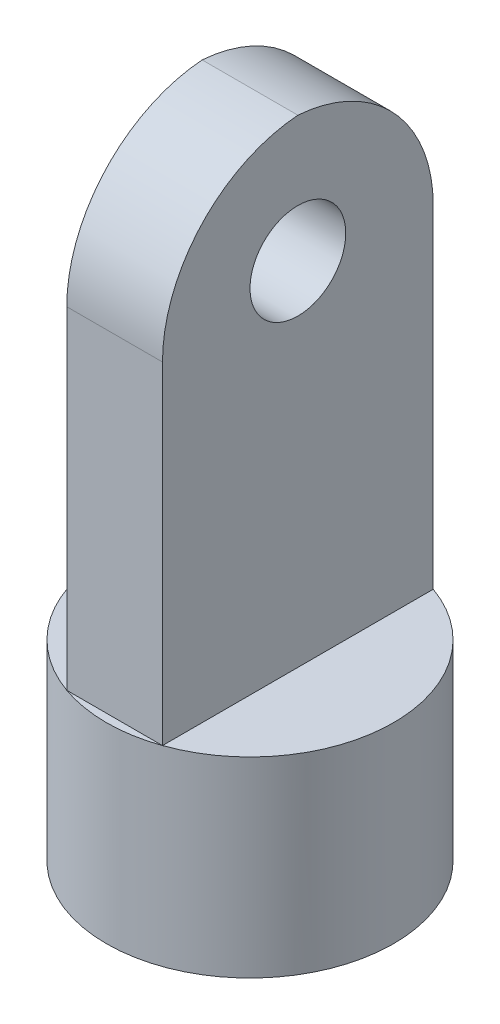
ISO-10303-21;
HEADER;
FILE_DESCRIPTION(('STEP AP214'),'2;1');
FILE_NAME('part.step','',(''),(''),'','','');
FILE_SCHEMA(('AUTOMOTIVE_DESIGN { 1 0 10303 214 1 1 1 1 }'));
ENDSEC;
DATA;
#1=APPLICATION_CONTEXT('core data for automotive mechanical design processes');
#2=APPLICATION_PROTOCOL_DEFINITION('international standard','automotive_design',2000,#1);
#3=PRODUCT_CONTEXT('',#1,'mechanical');
#4=PRODUCT('Part','Part','',(#3));
#5=PRODUCT_RELATED_PRODUCT_CATEGORY('part','',(#4));
#6=PRODUCT_DEFINITION_FORMATION('','',#4);
#7=PRODUCT_DEFINITION_CONTEXT('part definition',#1,'design');
#8=PRODUCT_DEFINITION('design','',#6,#7);
#9=PRODUCT_DEFINITION_SHAPE('','',#8);
#10=(LENGTH_UNIT() NAMED_UNIT(*) SI_UNIT(.MILLI.,.METRE.));
#11=(NAMED_UNIT(*) PLANE_ANGLE_UNIT() SI_UNIT($,.RADIAN.));
#12=(NAMED_UNIT(*) SI_UNIT($,.STERADIAN.) SOLID_ANGLE_UNIT());
#13=UNCERTAINTY_MEASURE_WITH_UNIT(LENGTH_MEASURE(1.E-05),#10,'distance_accuracy_value','');
#14=(GEOMETRIC_REPRESENTATION_CONTEXT(3) GLOBAL_UNCERTAINTY_ASSIGNED_CONTEXT((#13)) GLOBAL_UNIT_ASSIGNED_CONTEXT((#10,
#11,#12)) REPRESENTATION_CONTEXT('',''));
#15=CARTESIAN_POINT('',(0.,0.,0.));
#16=DIRECTION('',(0.,0.,1.));
#17=DIRECTION('',(1.,0.,0.));
#18=AXIS2_PLACEMENT_3D('',#15,#16,#17);
#19=CARTESIAN_POINT('',(0.,10.,0.));
#20=DIRECTION('',(0.,1.,0.));
#21=DIRECTION('',(0.,0.,1.));
#22=AXIS2_PLACEMENT_3D('',#19,#20,#21);
#23=PLANE('',#22);
#24=DIRECTION('',(0.,0.,-1.));
#25=VECTOR('',#24,1.);
#26=CARTESIAN_POINT('',(2.5,10.,7.07106781186547));
#27=LINE('',#26,#25);
#28=CARTESIAN_POINT('',(2.5,10.,7.07106781186547));
#29=VERTEX_POINT('',#28);
#30=CARTESIAN_POINT('',(2.5,10.,-7.07106781186548));
#31=VERTEX_POINT('',#30);
#32=EDGE_CURVE('E116',#29,#31,#27,.T.);
#33=ORIENTED_EDGE('',*,*,#32,.F.);
#34=CARTESIAN_POINT('',(0.,10.,0.));
#35=DIRECTION('',(0.,1.,0.));
#36=DIRECTION('',(0.,0.,1.));
#37=AXIS2_PLACEMENT_3D('',#34,#35,#36);
#38=CIRCLE('',#37,7.5);
#39=EDGE_CURVE('E102',#29,#31,#38,.T.);
#40=ORIENTED_EDGE('',*,*,#39,.T.);
#41=EDGE_LOOP('',(#33,#40));
#42=FACE_BOUND('',#41,.T.);
#43=ADVANCED_FACE('F33',(#42),#23,.T.);
#44=DIRECTION('',(1.,0.,0.));
#45=VECTOR('',#44,1.);
#46=CARTESIAN_POINT('',(-2.5,10.,7.07106781186547));
#47=LINE('',#46,#45);
#48=CARTESIAN_POINT('',(-2.5,10.,7.07106781186547));
#49=VERTEX_POINT('',#48);
#50=EDGE_CURVE('E113',#49,#29,#47,.T.);
#51=ORIENTED_EDGE('',*,*,#50,.F.);
#52=EDGE_CURVE('E110',#49,#29,#38,.T.);
#53=ORIENTED_EDGE('',*,*,#52,.T.);
#54=EDGE_LOOP('',(#51,#53));
#55=FACE_BOUND('',#54,.T.);
#56=ADVANCED_FACE('F150',(#55),#23,.T.);
#57=DIRECTION('',(0.,0.,1.));
#58=VECTOR('',#57,1.);
#59=CARTESIAN_POINT('',(-2.5,10.,7.07106781186547));
#60=LINE('',#59,#58);
#61=CARTESIAN_POINT('',(-2.5,10.,-7.07106781186548));
#62=VERTEX_POINT('',#61);
#63=EDGE_CURVE('E82',#62,#49,#60,.T.);
#64=ORIENTED_EDGE('',*,*,#63,.F.);
#65=EDGE_CURVE('E103',#62,#49,#38,.T.);
#66=ORIENTED_EDGE('',*,*,#65,.T.);
#67=EDGE_LOOP('',(#64,#66));
#68=FACE_BOUND('',#67,.T.);
#69=ADVANCED_FACE('F112',(#68),#23,.T.);
#70=CARTESIAN_POINT('',(0.,10.,0.));
#71=DIRECTION('',(0.,-1.,0.));
#72=DIRECTION('',(0.,0.,-1.));
#73=AXIS2_PLACEMENT_3D('',#70,#71,#72);
#74=CYLINDRICAL_SURFACE('',#73,7.5);
#75=ORIENTED_EDGE('',*,*,#39,.F.);
#76=ORIENTED_EDGE('',*,*,#52,.F.);
#77=ORIENTED_EDGE('',*,*,#65,.F.);
#78=EDGE_CURVE('E95',#31,#62,#38,.T.);
#79=ORIENTED_EDGE('',*,*,#78,.F.);
#80=EDGE_LOOP('',(#75,#76,#77,#79));
#81=FACE_BOUND('',#80,.T.);
#82=CARTESIAN_POINT('',(0.,0.,0.));
#83=DIRECTION('',(0.,1.,0.));
#84=DIRECTION('',(0.,0.,1.));
#85=AXIS2_PLACEMENT_3D('',#82,#83,#84);
#86=CIRCLE('',#85,7.5);
#87=CARTESIAN_POINT('',(0.,0.,7.5));
#88=VERTEX_POINT('',#87);
#89=EDGE_CURVE('E133',#88,#88,#86,.T.);
#90=ORIENTED_EDGE('',*,*,#89,.T.);
#91=EDGE_LOOP('',(#90));
#92=FACE_BOUND('',#91,.T.);
#93=ADVANCED_FACE('F107',(#81,#92),#74,.T.);
#94=DIRECTION('',(-1.,0.,0.));
#95=VECTOR('',#94,1.);
#96=CARTESIAN_POINT('',(-2.5,10.,-7.07106781186548));
#97=LINE('',#96,#95);
#98=EDGE_CURVE('E98',#31,#62,#97,.T.);
#99=ORIENTED_EDGE('',*,*,#98,.F.);
#100=ORIENTED_EDGE('',*,*,#78,.T.);
#101=EDGE_LOOP('',(#99,#100));
#102=FACE_BOUND('',#101,.T.);
#103=ADVANCED_FACE('F97',(#102),#23,.T.);
#104=CARTESIAN_POINT('',(0.,0.,0.));
#105=DIRECTION('',(0.,1.,0.));
#106=DIRECTION('',(0.,0.,1.));
#107=AXIS2_PLACEMENT_3D('',#104,#105,#106);
#108=PLANE('',#107);
#109=CARTESIAN_POINT('',(0.,0.,0.));
#110=DIRECTION('',(0.,-1.,0.));
#111=DIRECTION('',(0.,0.,-1.));
#112=AXIS2_PLACEMENT_3D('',#109,#110,#111);
#113=CIRCLE('',#112,6.25);
#114=CARTESIAN_POINT('',(0.,0.,-6.25));
#115=VERTEX_POINT('',#114);
#116=EDGE_CURVE('E129',#115,#115,#113,.T.);
#117=ORIENTED_EDGE('',*,*,#116,.F.);
#118=EDGE_LOOP('',(#117));
#119=FACE_BOUND('',#118,.T.);
#120=ORIENTED_EDGE('',*,*,#89,.F.);
#121=EDGE_LOOP('',(#120));
#122=FACE_BOUND('',#121,.T.);
#123=ADVANCED_FACE('F174',(#119,#122),#108,.F.);
#124=CARTESIAN_POINT('',(0.,7.5,0.));
#125=DIRECTION('',(0.,-1.,0.));
#126=DIRECTION('',(0.,0.,-1.));
#127=AXIS2_PLACEMENT_3D('',#124,#125,#126);
#128=CYLINDRICAL_SURFACE('',#127,6.25);
#129=CARTESIAN_POINT('',(0.,7.5,0.));
#130=DIRECTION('',(0.,-1.,0.));
#131=DIRECTION('',(0.,0.,-1.));
#132=AXIS2_PLACEMENT_3D('',#129,#130,#131);
#133=CIRCLE('',#132,6.25);
#134=CARTESIAN_POINT('',(0.,7.5,-6.25));
#135=VERTEX_POINT('',#134);
#136=EDGE_CURVE('E130',#135,#135,#133,.T.);
#137=ORIENTED_EDGE('',*,*,#136,.F.);
#138=EDGE_LOOP('',(#137));
#139=FACE_BOUND('',#138,.T.);
#140=ORIENTED_EDGE('',*,*,#116,.T.);
#141=EDGE_LOOP('',(#140));
#142=FACE_BOUND('',#141,.T.);
#143=ADVANCED_FACE('F179',(#139,#142),#128,.F.);
#144=CARTESIAN_POINT('',(0.,7.5,0.));
#145=DIRECTION('',(0.,-1.,0.));
#146=DIRECTION('',(0.,0.,-1.));
#147=AXIS2_PLACEMENT_3D('',#144,#145,#146);
#148=PLANE('',#147);
#149=ORIENTED_EDGE('',*,*,#136,.T.);
#150=EDGE_LOOP('',(#149));
#151=FACE_BOUND('',#150,.T.);
#152=ADVANCED_FACE('F216',(#151),#148,.T.);
#153=CARTESIAN_POINT('',(2.5,35.,7.07106781186547));
#154=DIRECTION('',(-1.,0.,0.));
#155=DIRECTION('',(0.,0.,1.));
#156=AXIS2_PLACEMENT_3D('',#153,#154,#155);
#157=PLANE('',#156);
#158=CARTESIAN_POINT('',(2.5,28.3918354921298,0.));
#159=DIRECTION('',(1.,0.,0.));
#160=DIRECTION('',(0.,0.,-1.));
#161=AXIS2_PLACEMENT_3D('',#158,#159,#160);
#162=CIRCLE('',#161,2.5);
#163=CARTESIAN_POINT('',(2.5,28.3918354921298,-2.5));
#164=VERTEX_POINT('',#163);
#165=EDGE_CURVE('E158',#164,#164,#162,.T.);
#166=ORIENTED_EDGE('',*,*,#165,.F.);
#167=EDGE_LOOP('',(#166));
#168=FACE_BOUND('',#167,.T.);
#169=DIRECTION('',(0.,-1.,0.));
#170=VECTOR('',#169,1.);
#171=CARTESIAN_POINT('',(2.5,35.,-7.07106781186548));
#172=LINE('',#171,#170);
#173=CARTESIAN_POINT('',(2.5,27.35,-7.07106781186548));
#174=VERTEX_POINT('',#173);
#175=EDGE_CURVE('E89',#174,#31,#172,.T.);
#176=ORIENTED_EDGE('',*,*,#175,.F.);
#177=CARTESIAN_POINT('',(2.5,27.35,0.578932188134525));
#178=DIRECTION('',(-1.,0.,0.));
#179=DIRECTION('',(0.,0.,1.));
#180=AXIS2_PLACEMENT_3D('',#177,#178,#179);
#181=CIRCLE('',#180,7.65);
#182=CARTESIAN_POINT('',(2.5,34.978062501156,0.));
#183=VERTEX_POINT('',#182);
#184=EDGE_CURVE('E42',#174,#183,#181,.F.);
#185=ORIENTED_EDGE('',*,*,#184,.T.);
#186=CARTESIAN_POINT('',(2.5,27.35,-0.578932188134526));
#187=DIRECTION('',(-1.,0.,0.));
#188=DIRECTION('',(0.,0.,1.));
#189=AXIS2_PLACEMENT_3D('',#186,#187,#188);
#190=CIRCLE('',#189,7.65);
#191=CARTESIAN_POINT('',(2.5,27.35,7.07106781186547));
#192=VERTEX_POINT('',#191);
#193=EDGE_CURVE('E52',#183,#192,#190,.F.);
#194=ORIENTED_EDGE('',*,*,#193,.T.);
#195=DIRECTION('',(0.,-1.,0.));
#196=VECTOR('',#195,1.);
#197=CARTESIAN_POINT('',(2.5,35.,7.07106781186547));
#198=LINE('',#197,#196);
#199=EDGE_CURVE('E125',#192,#29,#198,.T.);
#200=ORIENTED_EDGE('',*,*,#199,.T.);
#201=ORIENTED_EDGE('',*,*,#32,.T.);
#202=EDGE_LOOP('',(#176,#185,#194,#200,#201));
#203=FACE_BOUND('',#202,.T.);
#204=ADVANCED_FACE('F145',(#168,#203),#157,.F.);
#205=CARTESIAN_POINT('',(-2.5,35.,-7.07106781186548));
#206=DIRECTION('',(0.,0.,1.));
#207=DIRECTION('',(1.,0.,0.));
#208=AXIS2_PLACEMENT_3D('',#205,#206,#207);
#209=PLANE('',#208);
#210=DIRECTION('',(0.,-1.,0.));
#211=VECTOR('',#210,1.);
#212=CARTESIAN_POINT('',(-2.5,35.,-7.07106781186548));
#213=LINE('',#212,#211);
#214=CARTESIAN_POINT('',(-2.5,27.35,-7.07106781186548));
#215=VERTEX_POINT('',#214);
#216=EDGE_CURVE('E77',#215,#62,#213,.T.);
#217=ORIENTED_EDGE('',*,*,#216,.F.);
#218=DIRECTION('',(-1.,0.,0.));
#219=VECTOR('',#218,1.);
#220=CARTESIAN_POINT('',(-2.5,27.35,-7.07106781186548));
#221=LINE('',#220,#219);
#222=EDGE_CURVE('E141',#215,#174,#221,.F.);
#223=ORIENTED_EDGE('',*,*,#222,.T.);
#224=ORIENTED_EDGE('',*,*,#175,.T.);
#225=ORIENTED_EDGE('',*,*,#98,.T.);
#226=EDGE_LOOP('',(#217,#223,#224,#225));
#227=FACE_BOUND('',#226,.T.);
#228=ADVANCED_FACE('F115',(#227),#209,.F.);
#229=CARTESIAN_POINT('',(-2.5,35.,7.07106781186547));
#230=DIRECTION('',(1.,0.,0.));
#231=DIRECTION('',(0.,0.,-1.));
#232=AXIS2_PLACEMENT_3D('',#229,#230,#231);
#233=PLANE('',#232);
#234=CARTESIAN_POINT('',(-2.5,28.3918354921298,0.));
#235=DIRECTION('',(1.,0.,0.));
#236=DIRECTION('',(0.,0.,-1.));
#237=AXIS2_PLACEMENT_3D('',#234,#235,#236);
#238=CIRCLE('',#237,2.5);
#239=CARTESIAN_POINT('',(-2.5,28.3918354921298,-2.5));
#240=VERTEX_POINT('',#239);
#241=EDGE_CURVE('E119',#240,#240,#238,.T.);
#242=ORIENTED_EDGE('',*,*,#241,.T.);
#243=EDGE_LOOP('',(#242));
#244=FACE_BOUND('',#243,.T.);
#245=CARTESIAN_POINT('',(-2.5,27.35,-0.578932188134526));
#246=DIRECTION('',(1.,0.,0.));
#247=DIRECTION('',(0.,0.,-1.));
#248=AXIS2_PLACEMENT_3D('',#245,#246,#247);
#249=CIRCLE('',#248,7.65);
#250=CARTESIAN_POINT('',(-2.5,27.35,7.07106781186547));
#251=VERTEX_POINT('',#250);
#252=CARTESIAN_POINT('',(-2.5,34.978062501156,0.));
#253=VERTEX_POINT('',#252);
#254=EDGE_CURVE('E136',#251,#253,#249,.F.);
#255=ORIENTED_EDGE('',*,*,#254,.T.);
#256=CARTESIAN_POINT('',(-2.5,27.35,0.578932188134525));
#257=DIRECTION('',(1.,0.,0.));
#258=DIRECTION('',(0.,0.,-1.));
#259=AXIS2_PLACEMENT_3D('',#256,#257,#258);
#260=CIRCLE('',#259,7.65);
#261=EDGE_CURVE('E84',#253,#215,#260,.F.);
#262=ORIENTED_EDGE('',*,*,#261,.T.);
#263=ORIENTED_EDGE('',*,*,#216,.T.);
#264=ORIENTED_EDGE('',*,*,#63,.T.);
#265=DIRECTION('',(0.,-1.,0.));
#266=VECTOR('',#265,1.);
#267=CARTESIAN_POINT('',(-2.5,35.,7.07106781186547));
#268=LINE('',#267,#266);
#269=EDGE_CURVE('E90',#251,#49,#268,.T.);
#270=ORIENTED_EDGE('',*,*,#269,.F.);
#271=EDGE_LOOP('',(#255,#262,#263,#264,#270));
#272=FACE_BOUND('',#271,.T.);
#273=ADVANCED_FACE('F79',(#244,#272),#233,.F.);
#274=CARTESIAN_POINT('',(-2.5,35.,7.07106781186547));
#275=DIRECTION('',(0.,0.,-1.));
#276=DIRECTION('',(-1.,0.,0.));
#277=AXIS2_PLACEMENT_3D('',#274,#275,#276);
#278=PLANE('',#277);
#279=ORIENTED_EDGE('',*,*,#199,.F.);
#280=DIRECTION('',(1.,0.,0.));
#281=VECTOR('',#280,1.);
#282=CARTESIAN_POINT('',(-2.5,27.35,7.07106781186547));
#283=LINE('',#282,#281);
#284=EDGE_CURVE('E11',#192,#251,#283,.F.);
#285=ORIENTED_EDGE('',*,*,#284,.T.);
#286=ORIENTED_EDGE('',*,*,#269,.T.);
#287=ORIENTED_EDGE('',*,*,#50,.T.);
#288=EDGE_LOOP('',(#279,#285,#286,#287));
#289=FACE_BOUND('',#288,.T.);
#290=ADVANCED_FACE('F152',(#289),#278,.F.);
#291=CARTESIAN_POINT('',(-2.5,28.3918354921298,0.));
#292=DIRECTION('',(1.,0.,0.));
#293=DIRECTION('',(0.,0.,-1.));
#294=AXIS2_PLACEMENT_3D('',#291,#292,#293);
#295=CYLINDRICAL_SURFACE('',#294,2.5);
#296=ORIENTED_EDGE('',*,*,#241,.F.);
#297=EDGE_LOOP('',(#296));
#298=FACE_BOUND('',#297,.T.);
#299=ORIENTED_EDGE('',*,*,#165,.T.);
#300=EDGE_LOOP('',(#299));
#301=FACE_BOUND('',#300,.T.);
#302=ADVANCED_FACE('F164',(#298,#301),#295,.F.);
#303=CARTESIAN_POINT('',(0.,27.35,-0.578932188134526));
#304=DIRECTION('',(1.,0.,0.));
#305=DIRECTION('',(0.,0.,-1.));
#306=AXIS2_PLACEMENT_3D('',#303,#304,#305);
#307=CYLINDRICAL_SURFACE('',#306,7.65);
#308=ORIENTED_EDGE('',*,*,#284,.F.);
#309=ORIENTED_EDGE('',*,*,#193,.F.);
#310=DIRECTION('',(1.,0.,0.));
#311=VECTOR('',#310,1.);
#312=CARTESIAN_POINT('',(0.,34.978062501156,0.));
#313=LINE('',#312,#311);
#314=EDGE_CURVE('E37',#253,#183,#313,.T.);
#315=ORIENTED_EDGE('',*,*,#314,.F.);
#316=ORIENTED_EDGE('',*,*,#254,.F.);
#317=EDGE_LOOP('',(#308,#309,#315,#316));
#318=FACE_BOUND('',#317,.T.);
#319=ADVANCED_FACE('F35',(#318),#307,.T.);
#320=CARTESIAN_POINT('',(0.,27.35,0.578932188134525));
#321=DIRECTION('',(-1.,0.,0.));
#322=DIRECTION('',(0.,0.,1.));
#323=AXIS2_PLACEMENT_3D('',#320,#321,#322);
#324=CYLINDRICAL_SURFACE('',#323,7.65);
#325=ORIENTED_EDGE('',*,*,#184,.F.);
#326=ORIENTED_EDGE('',*,*,#222,.F.);
#327=ORIENTED_EDGE('',*,*,#261,.F.);
#328=ORIENTED_EDGE('',*,*,#314,.T.);
#329=EDGE_LOOP('',(#325,#326,#327,#328));
#330=FACE_BOUND('',#329,.T.);
#331=ADVANCED_FACE('F159',(#330),#324,.T.);
#332=CLOSED_SHELL('',(#43,#56,#69,#93,#103,#123,#143,#152,#204,#228,#273,#290,#302,#319,#331));
#333=MANIFOLD_SOLID_BREP('B2',#332);
#334=ADVANCED_BREP_SHAPE_REPRESENTATION('',(#18,#333),#14);
#335=SHAPE_DEFINITION_REPRESENTATION(#9,#334);
ENDSEC;
END-ISO-10303-21;
